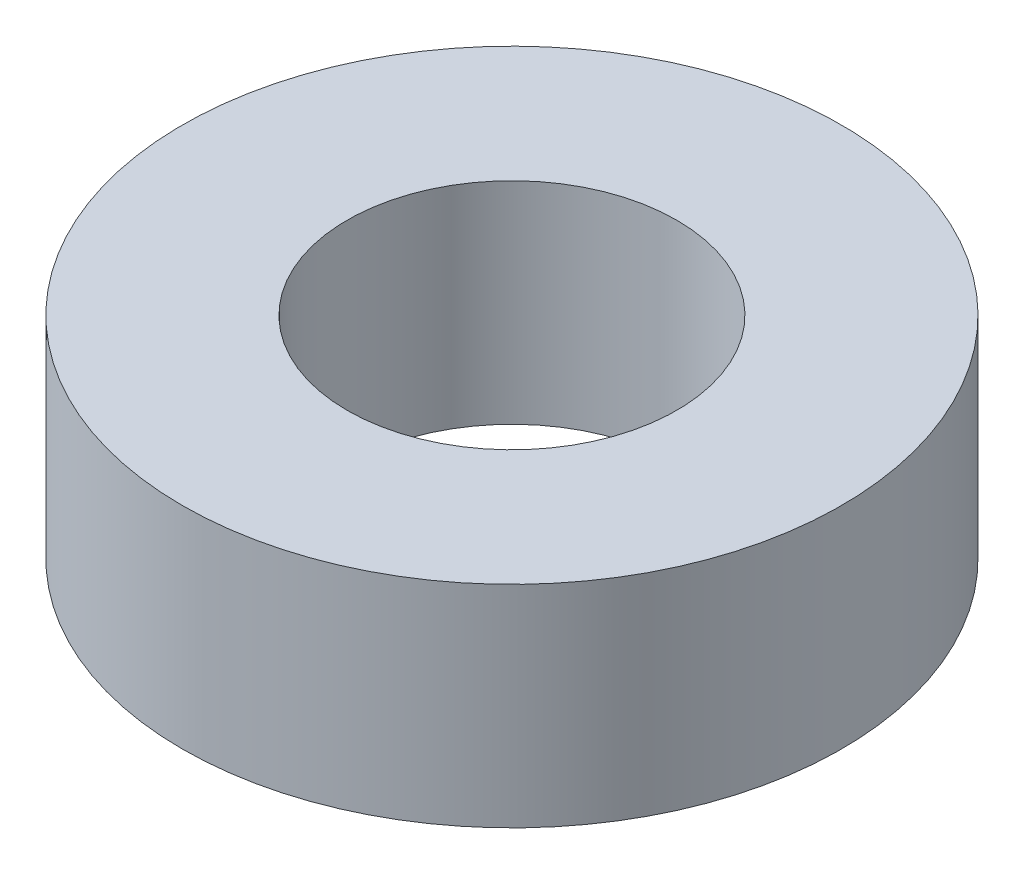
ISO-10303-21;
HEADER;
FILE_DESCRIPTION(('STEP AP214'),'2;1');
FILE_NAME('part.step','',(''),(''),'','','');
FILE_SCHEMA(('AUTOMOTIVE_DESIGN { 1 0 10303 214 1 1 1 1 }'));
ENDSEC;
DATA;
#1=APPLICATION_CONTEXT('core data for automotive mechanical design processes');
#2=APPLICATION_PROTOCOL_DEFINITION('international standard','automotive_design',2000,#1);
#3=PRODUCT_CONTEXT('',#1,'mechanical');
#4=PRODUCT('Part','Part','',(#3));
#5=PRODUCT_RELATED_PRODUCT_CATEGORY('part','',(#4));
#6=PRODUCT_DEFINITION_FORMATION('','',#4);
#7=PRODUCT_DEFINITION_CONTEXT('part definition',#1,'design');
#8=PRODUCT_DEFINITION('design','',#6,#7);
#9=PRODUCT_DEFINITION_SHAPE('','',#8);
#10=(LENGTH_UNIT() NAMED_UNIT(*) SI_UNIT(.MILLI.,.METRE.));
#11=(NAMED_UNIT(*) PLANE_ANGLE_UNIT() SI_UNIT($,.RADIAN.));
#12=(NAMED_UNIT(*) SI_UNIT($,.STERADIAN.) SOLID_ANGLE_UNIT());
#13=UNCERTAINTY_MEASURE_WITH_UNIT(LENGTH_MEASURE(1.E-05),#10,'distance_accuracy_value','');
#14=(GEOMETRIC_REPRESENTATION_CONTEXT(3) GLOBAL_UNCERTAINTY_ASSIGNED_CONTEXT((#13)) GLOBAL_UNIT_ASSIGNED_CONTEXT((#10,
#11,#12)) REPRESENTATION_CONTEXT('',''));
#15=CARTESIAN_POINT('',(0.,0.,0.));
#16=DIRECTION('',(0.,0.,1.));
#17=DIRECTION('',(1.,0.,0.));
#18=AXIS2_PLACEMENT_3D('',#15,#16,#17);
#19=CARTESIAN_POINT('',(0.,8.,0.));
#20=DIRECTION('',(0.,1.,0.));
#21=DIRECTION('',(0.,0.,1.));
#22=AXIS2_PLACEMENT_3D('',#19,#20,#21);
#23=PLANE('',#22);
#24=CARTESIAN_POINT('',(0.,8.,0.));
#25=DIRECTION('',(0.,1.,0.));
#26=DIRECTION('',(0.,0.,1.));
#27=AXIS2_PLACEMENT_3D('',#24,#25,#26);
#28=CIRCLE('',#27,12.5);
#29=CARTESIAN_POINT('',(0.,8.,12.5));
#30=VERTEX_POINT('',#29);
#31=EDGE_CURVE('E10',#30,#30,#28,.T.);
#32=ORIENTED_EDGE('',*,*,#31,.T.);
#33=EDGE_LOOP('',(#32));
#34=FACE_BOUND('',#33,.T.);
#35=CARTESIAN_POINT('',(0.,8.,0.));
#36=DIRECTION('',(0.,1.,0.));
#37=DIRECTION('',(0.,0.,1.));
#38=AXIS2_PLACEMENT_3D('',#35,#36,#37);
#39=CIRCLE('',#38,6.25);
#40=CARTESIAN_POINT('',(0.,8.,6.25));
#41=VERTEX_POINT('',#40);
#42=EDGE_CURVE('E49',#41,#41,#39,.T.);
#43=ORIENTED_EDGE('',*,*,#42,.F.);
#44=EDGE_LOOP('',(#43));
#45=FACE_BOUND('',#44,.T.);
#46=ADVANCED_FACE('F39',(#34,#45),#23,.T.);
#47=CARTESIAN_POINT('',(0.,0.,0.));
#48=DIRECTION('',(0.,1.,0.));
#49=DIRECTION('',(0.,0.,1.));
#50=AXIS2_PLACEMENT_3D('',#47,#48,#49);
#51=PLANE('',#50);
#52=CARTESIAN_POINT('',(0.,0.,0.));
#53=DIRECTION('',(0.,1.,0.));
#54=DIRECTION('',(0.,0.,1.));
#55=AXIS2_PLACEMENT_3D('',#52,#53,#54);
#56=CIRCLE('',#55,12.5);
#57=CARTESIAN_POINT('',(0.,0.,12.5));
#58=VERTEX_POINT('',#57);
#59=EDGE_CURVE('E43',#58,#58,#56,.T.);
#60=ORIENTED_EDGE('',*,*,#59,.F.);
#61=EDGE_LOOP('',(#60));
#62=FACE_BOUND('',#61,.T.);
#63=CARTESIAN_POINT('',(0.,0.,0.));
#64=DIRECTION('',(0.,1.,0.));
#65=DIRECTION('',(0.,0.,1.));
#66=AXIS2_PLACEMENT_3D('',#63,#64,#65);
#67=CIRCLE('',#66,6.25);
#68=CARTESIAN_POINT('',(0.,0.,6.25));
#69=VERTEX_POINT('',#68);
#70=EDGE_CURVE('E55',#69,#69,#67,.T.);
#71=ORIENTED_EDGE('',*,*,#70,.T.);
#72=EDGE_LOOP('',(#71));
#73=FACE_BOUND('',#72,.T.);
#74=ADVANCED_FACE('F62',(#62,#73),#51,.F.);
#75=CARTESIAN_POINT('',(0.,8.,0.));
#76=DIRECTION('',(0.,-1.,0.));
#77=DIRECTION('',(0.,0.,-1.));
#78=AXIS2_PLACEMENT_3D('',#75,#76,#77);
#79=CYLINDRICAL_SURFACE('',#78,12.5);
#80=ORIENTED_EDGE('',*,*,#31,.F.);
#81=EDGE_LOOP('',(#80));
#82=FACE_BOUND('',#81,.T.);
#83=ORIENTED_EDGE('',*,*,#59,.T.);
#84=EDGE_LOOP('',(#83));
#85=FACE_BOUND('',#84,.T.);
#86=ADVANCED_FACE('F41',(#82,#85),#79,.T.);
#87=CARTESIAN_POINT('',(0.,8.,0.));
#88=DIRECTION('',(0.,-1.,0.));
#89=DIRECTION('',(0.,0.,-1.));
#90=AXIS2_PLACEMENT_3D('',#87,#88,#89);
#91=CYLINDRICAL_SURFACE('',#90,6.25);
#92=ORIENTED_EDGE('',*,*,#42,.T.);
#93=EDGE_LOOP('',(#92));
#94=FACE_BOUND('',#93,.T.);
#95=ORIENTED_EDGE('',*,*,#70,.F.);
#96=EDGE_LOOP('',(#95));
#97=FACE_BOUND('',#96,.T.);
#98=ADVANCED_FACE('F59',(#94,#97),#91,.F.);
#99=CLOSED_SHELL('',(#46,#74,#86,#98));
#100=MANIFOLD_SOLID_BREP('B2',#99);
#101=ADVANCED_BREP_SHAPE_REPRESENTATION('',(#18,#100),#14);
#102=SHAPE_DEFINITION_REPRESENTATION(#9,#101);
ENDSEC;
END-ISO-10303-21;
